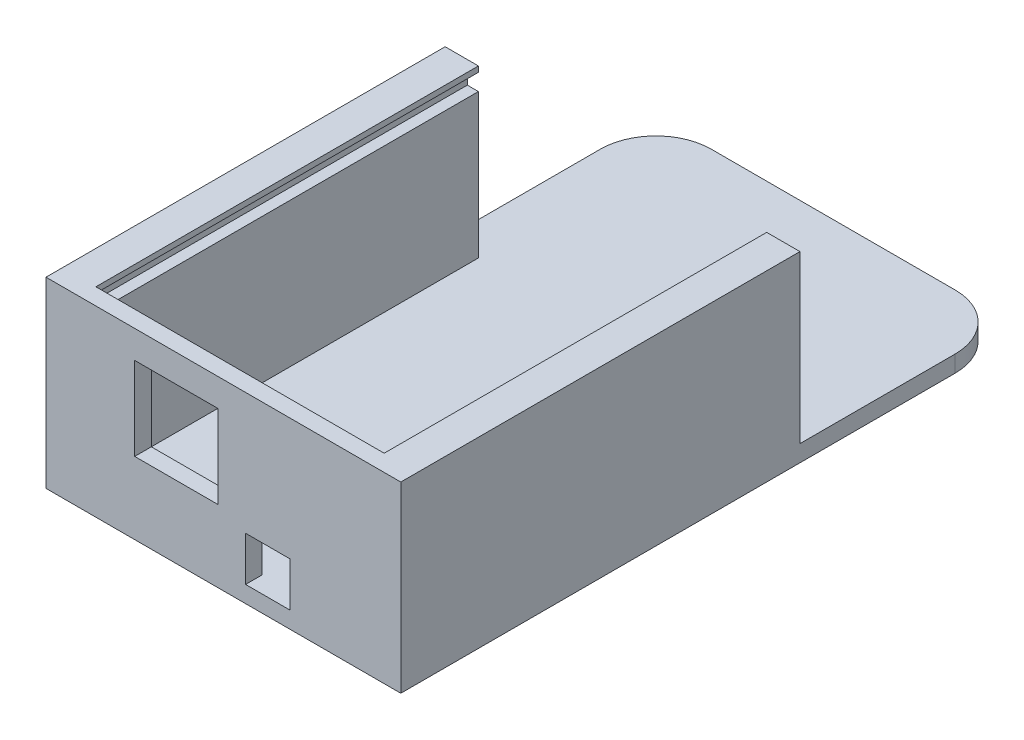
ISO-10303-21;
HEADER;
FILE_DESCRIPTION(('STEP AP214'),'2;1');
FILE_NAME('part.step','',(''),(''),'','','');
FILE_SCHEMA(('AUTOMOTIVE_DESIGN { 1 0 10303 214 1 1 1 1 }'));
ENDSEC;
DATA;
#1=APPLICATION_CONTEXT('core data for automotive mechanical design processes');
#2=APPLICATION_PROTOCOL_DEFINITION('international standard','automotive_design',2000,#1);
#3=PRODUCT_CONTEXT('',#1,'mechanical');
#4=PRODUCT('Part','Part','',(#3));
#5=PRODUCT_RELATED_PRODUCT_CATEGORY('part','',(#4));
#6=PRODUCT_DEFINITION_FORMATION('','',#4);
#7=PRODUCT_DEFINITION_CONTEXT('part definition',#1,'design');
#8=PRODUCT_DEFINITION('design','',#6,#7);
#9=PRODUCT_DEFINITION_SHAPE('','',#8);
#10=(LENGTH_UNIT() NAMED_UNIT(*) SI_UNIT(.MILLI.,.METRE.));
#11=(NAMED_UNIT(*) PLANE_ANGLE_UNIT() SI_UNIT($,.RADIAN.));
#12=(NAMED_UNIT(*) SI_UNIT($,.STERADIAN.) SOLID_ANGLE_UNIT());
#13=UNCERTAINTY_MEASURE_WITH_UNIT(LENGTH_MEASURE(1.E-05),#10,'distance_accuracy_value','');
#14=(GEOMETRIC_REPRESENTATION_CONTEXT(3) GLOBAL_UNCERTAINTY_ASSIGNED_CONTEXT((#13)) GLOBAL_UNIT_ASSIGNED_CONTEXT((#10,
#11,#12)) REPRESENTATION_CONTEXT('',''));
#15=CARTESIAN_POINT('',(0.,0.,0.));
#16=DIRECTION('',(0.,0.,1.));
#17=DIRECTION('',(1.,0.,0.));
#18=AXIS2_PLACEMENT_3D('',#15,#16,#17);
#19=CARTESIAN_POINT('',(-26.,33.,0.));
#20=DIRECTION('',(-1.,0.,0.));
#21=DIRECTION('',(0.,0.,1.));
#22=AXIS2_PLACEMENT_3D('',#19,#20,#21);
#23=PLANE('',#22);
#24=DIRECTION('',(0.,0.,-1.));
#25=VECTOR('',#24,1.);
#26=CARTESIAN_POINT('',(-26.,29.,0.605551275463995));
#27=LINE('',#26,#25);
#28=CARTESIAN_POINT('',(-26.,29.,-2.99999999999999));
#29=VERTEX_POINT('',#28);
#30=CARTESIAN_POINT('',(-26.,29.,-72.));
#31=VERTEX_POINT('',#30);
#32=EDGE_CURVE('E342',#29,#31,#27,.T.);
#33=ORIENTED_EDGE('',*,*,#32,.F.);
#34=DIRECTION('',(0.,-1.,0.));
#35=VECTOR('',#34,1.);
#36=CARTESIAN_POINT('',(-26.,33.,-2.99999999999999));
#37=LINE('',#36,#35);
#38=CARTESIAN_POINT('',(-26.,3.,-2.99999999999999));
#39=VERTEX_POINT('',#38);
#40=EDGE_CURVE('E384',#29,#39,#37,.T.);
#41=ORIENTED_EDGE('',*,*,#40,.T.);
#42=DIRECTION('',(0.,0.,-1.));
#43=VECTOR('',#42,1.);
#44=CARTESIAN_POINT('',(-26.,3.,0.));
#45=LINE('',#44,#43);
#46=CARTESIAN_POINT('',(-26.,3.,-72.));
#47=VERTEX_POINT('',#46);
#48=EDGE_CURVE('E330',#39,#47,#45,.T.);
#49=ORIENTED_EDGE('',*,*,#48,.T.);
#50=DIRECTION('',(0.,-1.,0.));
#51=VECTOR('',#50,1.);
#52=CARTESIAN_POINT('',(-26.,33.,-72.));
#53=LINE('',#52,#51);
#54=EDGE_CURVE('E379',#31,#47,#53,.T.);
#55=ORIENTED_EDGE('',*,*,#54,.F.);
#56=EDGE_LOOP('',(#33,#41,#49,#55));
#57=FACE_BOUND('',#56,.T.);
#58=ADVANCED_FACE('F45',(#57),#23,.F.);
#59=DIRECTION('',(0.,0.,-1.));
#60=VECTOR('',#59,1.);
#61=CARTESIAN_POINT('',(-26.,32.,0.605551275463995));
#62=LINE('',#61,#60);
#63=CARTESIAN_POINT('',(-26.,32.,-2.99999999999999));
#64=VERTEX_POINT('',#63);
#65=CARTESIAN_POINT('',(-26.,32.,-72.));
#66=VERTEX_POINT('',#65);
#67=EDGE_CURVE('E343',#64,#66,#62,.T.);
#68=ORIENTED_EDGE('',*,*,#67,.T.);
#69=CARTESIAN_POINT('',(-26.,33.,-72.));
#70=VERTEX_POINT('',#69);
#71=EDGE_CURVE('E380',#70,#66,#53,.T.);
#72=ORIENTED_EDGE('',*,*,#71,.F.);
#73=DIRECTION('',(0.,0.,-1.));
#74=VECTOR('',#73,1.);
#75=CARTESIAN_POINT('',(-26.,33.,0.));
#76=LINE('',#75,#74);
#77=CARTESIAN_POINT('',(-26.,33.,-2.99999999999999));
#78=VERTEX_POINT('',#77);
#79=EDGE_CURVE('E359',#78,#70,#76,.T.);
#80=ORIENTED_EDGE('',*,*,#79,.F.);
#81=EDGE_CURVE('E385',#78,#64,#37,.T.);
#82=ORIENTED_EDGE('',*,*,#81,.T.);
#83=EDGE_LOOP('',(#68,#72,#80,#82));
#84=FACE_BOUND('',#83,.T.);
#85=ADVANCED_FACE('F590',(#84),#23,.F.);
#86=CARTESIAN_POINT('',(0.,33.,-72.));
#87=DIRECTION('',(0.,0.,1.));
#88=DIRECTION('',(1.,0.,0.));
#89=AXIS2_PLACEMENT_3D('',#86,#87,#88);
#90=PLANE('',#89);
#91=DIRECTION('',(1.,0.,0.));
#92=VECTOR('',#91,1.);
#93=CARTESIAN_POINT('',(-28.,29.,-72.));
#94=LINE('',#93,#92);
#95=CARTESIAN_POINT('',(-28.,29.,-72.));
#96=VERTEX_POINT('',#95);
#97=EDGE_CURVE('E278',#96,#31,#94,.T.);
#98=ORIENTED_EDGE('',*,*,#97,.T.);
#99=ORIENTED_EDGE('',*,*,#54,.T.);
#100=DIRECTION('',(-1.,0.,0.));
#101=VECTOR('',#100,1.);
#102=CARTESIAN_POINT('',(0.,3.,-72.));
#103=LINE('',#102,#101);
#104=CARTESIAN_POINT('',(-32.,3.,-72.));
#105=VERTEX_POINT('',#104);
#106=EDGE_CURVE('E363',#47,#105,#103,.T.);
#107=ORIENTED_EDGE('',*,*,#106,.T.);
#108=DIRECTION('',(0.,-1.,0.));
#109=VECTOR('',#108,1.);
#110=CARTESIAN_POINT('',(-32.,33.,-72.));
#111=LINE('',#110,#109);
#112=CARTESIAN_POINT('',(-32.,33.,-72.));
#113=VERTEX_POINT('',#112);
#114=EDGE_CURVE('E370',#113,#105,#111,.T.);
#115=ORIENTED_EDGE('',*,*,#114,.F.);
#116=DIRECTION('',(-1.,0.,0.));
#117=VECTOR('',#116,1.);
#118=CARTESIAN_POINT('',(0.,33.,-72.));
#119=LINE('',#118,#117);
#120=EDGE_CURVE('E362',#70,#113,#119,.T.);
#121=ORIENTED_EDGE('',*,*,#120,.F.);
#122=ORIENTED_EDGE('',*,*,#71,.T.);
#123=DIRECTION('',(-0.707106781186544,-0.707106781186551,0.));
#124=VECTOR('',#123,1.);
#125=CARTESIAN_POINT('',(-26.,32.,-72.));
#126=LINE('',#125,#124);
#127=CARTESIAN_POINT('',(-28.,30.,-72.));
#128=VERTEX_POINT('',#127);
#129=EDGE_CURVE('E338',#66,#128,#126,.T.);
#130=ORIENTED_EDGE('',*,*,#129,.T.);
#131=DIRECTION('',(0.,-1.,0.));
#132=VECTOR('',#131,1.);
#133=CARTESIAN_POINT('',(-28.,30.,-72.));
#134=LINE('',#133,#132);
#135=EDGE_CURVE('E334',#128,#96,#134,.T.);
#136=ORIENTED_EDGE('',*,*,#135,.T.);
#137=EDGE_LOOP('',(#98,#99,#107,#115,#121,#122,#130,#136));
#138=FACE_BOUND('',#137,.T.);
#139=ADVANCED_FACE('F552',(#138),#90,.F.);
#140=CARTESIAN_POINT('',(0.,3.,0.));
#141=DIRECTION('',(0.,-1.,0.));
#142=DIRECTION('',(0.,0.,-1.));
#143=AXIS2_PLACEMENT_3D('',#140,#141,#142);
#144=PLANE('',#143);
#145=DIRECTION('',(-1.,0.,0.));
#146=VECTOR('',#145,1.);
#147=CARTESIAN_POINT('',(0.,3.,-110.));
#148=LINE('',#147,#146);
#149=CARTESIAN_POINT('',(22.,3.,-110.));
#150=VERTEX_POINT('',#149);
#151=CARTESIAN_POINT('',(-22.,3.,-110.));
#152=VERTEX_POINT('',#151);
#153=EDGE_CURVE('E484',#150,#152,#148,.T.);
#154=ORIENTED_EDGE('',*,*,#153,.T.);
#155=CARTESIAN_POINT('',(-22.,3.,-100.));
#156=DIRECTION('',(0.,-1.,0.));
#157=DIRECTION('',(0.,0.,-1.));
#158=AXIS2_PLACEMENT_3D('',#155,#156,#157);
#159=CIRCLE('',#158,10.);
#160=CARTESIAN_POINT('',(-32.,3.,-100.));
#161=VERTEX_POINT('',#160);
#162=EDGE_CURVE('E11',#152,#161,#159,.F.);
#163=ORIENTED_EDGE('',*,*,#162,.T.);
#164=DIRECTION('',(0.,0.,-1.));
#165=VECTOR('',#164,1.);
#166=CARTESIAN_POINT('',(-32.,3.,0.));
#167=LINE('',#166,#165);
#168=EDGE_CURVE('E390',#105,#161,#167,.T.);
#169=ORIENTED_EDGE('',*,*,#168,.F.);
#170=ORIENTED_EDGE('',*,*,#106,.F.);
#171=ORIENTED_EDGE('',*,*,#48,.F.);
#172=DIRECTION('',(1.,0.,0.));
#173=VECTOR('',#172,1.);
#174=CARTESIAN_POINT('',(0.,3.,-3.));
#175=LINE('',#174,#173);
#176=CARTESIAN_POINT('',(4.,3.,-3.));
#177=VERTEX_POINT('',#176);
#178=EDGE_CURVE('E456',#39,#177,#175,.T.);
#179=ORIENTED_EDGE('',*,*,#178,.T.);
#180=DIRECTION('',(0.,0.,-1.));
#181=VECTOR('',#180,1.);
#182=CARTESIAN_POINT('',(4.,3.,0.));
#183=LINE('',#182,#181);
#184=CARTESIAN_POINT('',(4.,3.,0.));
#185=VERTEX_POINT('',#184);
#186=EDGE_CURVE('E289',#185,#177,#183,.T.);
#187=ORIENTED_EDGE('',*,*,#186,.F.);
#188=DIRECTION('',(-1.,0.,0.));
#189=VECTOR('',#188,1.);
#190=CARTESIAN_POINT('',(12.,3.,0.));
#191=LINE('',#190,#189);
#192=CARTESIAN_POINT('',(12.,3.,0.));
#193=VERTEX_POINT('',#192);
#194=EDGE_CURVE('E314',#193,#185,#191,.T.);
#195=ORIENTED_EDGE('',*,*,#194,.F.);
#196=DIRECTION('',(0.,0.,-1.));
#197=VECTOR('',#196,1.);
#198=CARTESIAN_POINT('',(12.,3.,0.));
#199=LINE('',#198,#197);
#200=CARTESIAN_POINT('',(12.,3.,-3.));
#201=VERTEX_POINT('',#200);
#202=EDGE_CURVE('E284',#193,#201,#199,.T.);
#203=ORIENTED_EDGE('',*,*,#202,.T.);
#204=CARTESIAN_POINT('',(26.,3.,-3.));
#205=VERTEX_POINT('',#204);
#206=EDGE_CURVE('E434',#201,#205,#175,.T.);
#207=ORIENTED_EDGE('',*,*,#206,.T.);
#208=DIRECTION('',(0.,0.,-1.));
#209=VECTOR('',#208,1.);
#210=CARTESIAN_POINT('',(26.,3.,0.));
#211=LINE('',#210,#209);
#212=CARTESIAN_POINT('',(26.,3.,-72.));
#213=VERTEX_POINT('',#212);
#214=EDGE_CURVE('E440',#205,#213,#211,.T.);
#215=ORIENTED_EDGE('',*,*,#214,.T.);
#216=DIRECTION('',(1.,0.,0.));
#217=VECTOR('',#216,1.);
#218=CARTESIAN_POINT('',(0.,3.,-72.));
#219=LINE('',#218,#217);
#220=CARTESIAN_POINT('',(32.,3.,-72.));
#221=VERTEX_POINT('',#220);
#222=EDGE_CURVE('E460',#213,#221,#219,.T.);
#223=ORIENTED_EDGE('',*,*,#222,.T.);
#224=DIRECTION('',(0.,0.,-1.));
#225=VECTOR('',#224,1.);
#226=CARTESIAN_POINT('',(32.,3.,0.));
#227=LINE('',#226,#225);
#228=CARTESIAN_POINT('',(32.,3.,-100.));
#229=VERTEX_POINT('',#228);
#230=EDGE_CURVE('E480',#221,#229,#227,.T.);
#231=ORIENTED_EDGE('',*,*,#230,.T.);
#232=CARTESIAN_POINT('',(22.,3.,-100.));
#233=DIRECTION('',(0.,-1.,0.));
#234=DIRECTION('',(0.,0.,-1.));
#235=AXIS2_PLACEMENT_3D('',#232,#233,#234);
#236=CIRCLE('',#235,10.);
#237=EDGE_CURVE('E512',#229,#150,#236,.F.);
#238=ORIENTED_EDGE('',*,*,#237,.T.);
#239=EDGE_LOOP('',(#154,#163,#169,#170,#171,#179,#187,#195,#203,#207,#215,#223,#231,#238));
#240=FACE_BOUND('',#239,.T.);
#241=ADVANCED_FACE('F531',(#240),#144,.F.);
#242=CARTESIAN_POINT('',(26.,33.,0.));
#243=DIRECTION('',(-1.,0.,0.));
#244=DIRECTION('',(0.,0.,1.));
#245=AXIS2_PLACEMENT_3D('',#242,#243,#244);
#246=PLANE('',#245);
#247=DIRECTION('',(0.,0.,-1.));
#248=VECTOR('',#247,1.);
#249=CARTESIAN_POINT('',(26.,29.,0.605551275463995));
#250=LINE('',#249,#248);
#251=CARTESIAN_POINT('',(26.,29.,-3.));
#252=VERTEX_POINT('',#251);
#253=CARTESIAN_POINT('',(26.,29.,-72.));
#254=VERTEX_POINT('',#253);
#255=EDGE_CURVE('E406',#252,#254,#250,.T.);
#256=ORIENTED_EDGE('',*,*,#255,.T.);
#257=DIRECTION('',(0.,-1.,0.));
#258=VECTOR('',#257,1.);
#259=CARTESIAN_POINT('',(26.,33.,-72.));
#260=LINE('',#259,#258);
#261=EDGE_CURVE('E471',#254,#213,#260,.T.);
#262=ORIENTED_EDGE('',*,*,#261,.T.);
#263=ORIENTED_EDGE('',*,*,#214,.F.);
#264=DIRECTION('',(0.,-1.,0.));
#265=VECTOR('',#264,1.);
#266=CARTESIAN_POINT('',(26.,33.,-3.));
#267=LINE('',#266,#265);
#268=EDGE_CURVE('E455',#252,#205,#267,.T.);
#269=ORIENTED_EDGE('',*,*,#268,.F.);
#270=EDGE_LOOP('',(#256,#262,#263,#269));
#271=FACE_BOUND('',#270,.T.);
#272=ADVANCED_FACE('F612',(#271),#246,.T.);
#273=CARTESIAN_POINT('',(0.,3.,0.));
#274=DIRECTION('',(0.,0.,-1.));
#275=DIRECTION('',(-1.,0.,0.));
#276=AXIS2_PLACEMENT_3D('',#273,#274,#275);
#277=PLANE('',#276);
#278=DIRECTION('',(1.,0.,0.));
#279=VECTOR('',#278,1.);
#280=CARTESIAN_POINT('',(-0.999999999999997,28.,0.));
#281=LINE('',#280,#279);
#282=CARTESIAN_POINT('',(-16.,28.,0.));
#283=VERTEX_POINT('',#282);
#284=CARTESIAN_POINT('',(-0.999999999999997,28.,0.));
#285=VERTEX_POINT('',#284);
#286=EDGE_CURVE('E243',#283,#285,#281,.T.);
#287=ORIENTED_EDGE('',*,*,#286,.T.);
#288=DIRECTION('',(0.,-1.,0.));
#289=VECTOR('',#288,1.);
#290=CARTESIAN_POINT('',(-0.999999999999997,28.,0.));
#291=LINE('',#290,#289);
#292=CARTESIAN_POINT('',(-0.999999999999999,13.,0.));
#293=VERTEX_POINT('',#292);
#294=EDGE_CURVE('E234',#285,#293,#291,.T.);
#295=ORIENTED_EDGE('',*,*,#294,.T.);
#296=DIRECTION('',(-1.,0.,0.));
#297=VECTOR('',#296,1.);
#298=CARTESIAN_POINT('',(-0.999999999999999,13.,0.));
#299=LINE('',#298,#297);
#300=CARTESIAN_POINT('',(-16.,13.,0.));
#301=VERTEX_POINT('',#300);
#302=EDGE_CURVE('E246',#293,#301,#299,.T.);
#303=ORIENTED_EDGE('',*,*,#302,.T.);
#304=DIRECTION('',(0.,1.,0.));
#305=VECTOR('',#304,1.);
#306=CARTESIAN_POINT('',(-16.,28.,0.));
#307=LINE('',#306,#305);
#308=EDGE_CURVE('E61',#301,#283,#307,.T.);
#309=ORIENTED_EDGE('',*,*,#308,.T.);
#310=EDGE_LOOP('',(#287,#295,#303,#309));
#311=FACE_BOUND('',#310,.T.);
#312=DIRECTION('',(1.,0.,0.));
#313=VECTOR('',#312,1.);
#314=CARTESIAN_POINT('',(12.,11.,0.));
#315=LINE('',#314,#313);
#316=CARTESIAN_POINT('',(4.,11.,0.));
#317=VERTEX_POINT('',#316);
#318=CARTESIAN_POINT('',(12.,11.,0.));
#319=VERTEX_POINT('',#318);
#320=EDGE_CURVE('E288',#317,#319,#315,.T.);
#321=ORIENTED_EDGE('',*,*,#320,.T.);
#322=DIRECTION('',(0.,-1.,0.));
#323=VECTOR('',#322,1.);
#324=CARTESIAN_POINT('',(12.,11.,0.));
#325=LINE('',#324,#323);
#326=EDGE_CURVE('E303',#319,#193,#325,.T.);
#327=ORIENTED_EDGE('',*,*,#326,.T.);
#328=ORIENTED_EDGE('',*,*,#194,.T.);
#329=DIRECTION('',(0.,1.,0.));
#330=VECTOR('',#329,1.);
#331=CARTESIAN_POINT('',(4.,11.,0.));
#332=LINE('',#331,#330);
#333=EDGE_CURVE('E69',#185,#317,#332,.T.);
#334=ORIENTED_EDGE('',*,*,#333,.T.);
#335=EDGE_LOOP('',(#321,#327,#328,#334));
#336=FACE_BOUND('',#335,.T.);
#337=DIRECTION('',(1.,0.,0.));
#338=VECTOR('',#337,1.);
#339=CARTESIAN_POINT('',(0.,0.,0.));
#340=LINE('',#339,#338);
#341=CARTESIAN_POINT('',(-32.,0.,0.));
#342=VERTEX_POINT('',#341);
#343=CARTESIAN_POINT('',(32.,0.,0.));
#344=VERTEX_POINT('',#343);
#345=EDGE_CURVE('E479',#342,#344,#340,.T.);
#346=ORIENTED_EDGE('',*,*,#345,.T.);
#347=DIRECTION('',(0.,-1.,0.));
#348=VECTOR('',#347,1.);
#349=CARTESIAN_POINT('',(32.,3.,0.));
#350=LINE('',#349,#348);
#351=CARTESIAN_POINT('',(32.,33.,0.));
#352=VERTEX_POINT('',#351);
#353=EDGE_CURVE('E489',#352,#344,#350,.T.);
#354=ORIENTED_EDGE('',*,*,#353,.F.);
#355=DIRECTION('',(1.,0.,0.));
#356=VECTOR('',#355,1.);
#357=CARTESIAN_POINT('',(0.,33.,0.));
#358=LINE('',#357,#356);
#359=CARTESIAN_POINT('',(-32.,33.,0.));
#360=VERTEX_POINT('',#359);
#361=EDGE_CURVE('E439',#360,#352,#358,.T.);
#362=ORIENTED_EDGE('',*,*,#361,.F.);
#363=DIRECTION('',(0.,-1.,0.));
#364=VECTOR('',#363,1.);
#365=CARTESIAN_POINT('',(-32.,3.,0.));
#366=LINE('',#365,#364);
#367=EDGE_CURVE('E394',#360,#342,#366,.T.);
#368=ORIENTED_EDGE('',*,*,#367,.T.);
#369=EDGE_LOOP('',(#346,#354,#362,#368));
#370=FACE_BOUND('',#369,.T.);
#371=ADVANCED_FACE('F251',(#311,#336,#370),#277,.F.);
#372=CARTESIAN_POINT('',(32.,3.,0.));
#373=DIRECTION('',(-1.,0.,0.));
#374=DIRECTION('',(0.,0.,1.));
#375=AXIS2_PLACEMENT_3D('',#372,#373,#374);
#376=PLANE('',#375);
#377=DIRECTION('',(0.,0.,-1.));
#378=VECTOR('',#377,1.);
#379=CARTESIAN_POINT('',(32.,0.,0.));
#380=LINE('',#379,#378);
#381=CARTESIAN_POINT('',(32.,0.,-100.));
#382=VERTEX_POINT('',#381);
#383=EDGE_CURVE('E492',#344,#382,#380,.T.);
#384=ORIENTED_EDGE('',*,*,#383,.T.);
#385=DIRECTION('',(0.,-1.,0.));
#386=VECTOR('',#385,1.);
#387=CARTESIAN_POINT('',(32.,3.,-100.));
#388=LINE('',#387,#386);
#389=EDGE_CURVE('E509',#382,#229,#388,.F.);
#390=ORIENTED_EDGE('',*,*,#389,.T.);
#391=ORIENTED_EDGE('',*,*,#230,.F.);
#392=DIRECTION('',(0.,-1.,0.));
#393=VECTOR('',#392,1.);
#394=CARTESIAN_POINT('',(32.,33.,-72.));
#395=LINE('',#394,#393);
#396=CARTESIAN_POINT('',(32.,33.,-72.));
#397=VERTEX_POINT('',#396);
#398=EDGE_CURVE('E476',#397,#221,#395,.T.);
#399=ORIENTED_EDGE('',*,*,#398,.F.);
#400=DIRECTION('',(0.,0.,-1.));
#401=VECTOR('',#400,1.);
#402=CARTESIAN_POINT('',(32.,33.,0.));
#403=LINE('',#402,#401);
#404=EDGE_CURVE('E444',#352,#397,#403,.T.);
#405=ORIENTED_EDGE('',*,*,#404,.F.);
#406=ORIENTED_EDGE('',*,*,#353,.T.);
#407=EDGE_LOOP('',(#384,#390,#391,#399,#405,#406));
#408=FACE_BOUND('',#407,.T.);
#409=ADVANCED_FACE('F619',(#408),#376,.F.);
#410=CARTESIAN_POINT('',(0.,3.,-110.));
#411=DIRECTION('',(0.,0.,1.));
#412=DIRECTION('',(1.,0.,0.));
#413=AXIS2_PLACEMENT_3D('',#410,#411,#412);
#414=PLANE('',#413);
#415=DIRECTION('',(-1.,0.,0.));
#416=VECTOR('',#415,1.);
#417=CARTESIAN_POINT('',(0.,0.,-110.));
#418=LINE('',#417,#416);
#419=CARTESIAN_POINT('',(22.,0.,-110.));
#420=VERTEX_POINT('',#419);
#421=CARTESIAN_POINT('',(-22.,0.,-110.));
#422=VERTEX_POINT('',#421);
#423=EDGE_CURVE('E485',#420,#422,#418,.T.);
#424=ORIENTED_EDGE('',*,*,#423,.T.);
#425=DIRECTION('',(0.,-1.,0.));
#426=VECTOR('',#425,1.);
#427=CARTESIAN_POINT('',(-22.,3.,-110.));
#428=LINE('',#427,#426);
#429=EDGE_CURVE('E54',#422,#152,#428,.F.);
#430=ORIENTED_EDGE('',*,*,#429,.T.);
#431=ORIENTED_EDGE('',*,*,#153,.F.);
#432=DIRECTION('',(0.,-1.,0.));
#433=VECTOR('',#432,1.);
#434=CARTESIAN_POINT('',(22.,3.,-110.));
#435=LINE('',#434,#433);
#436=EDGE_CURVE('E502',#150,#420,#435,.T.);
#437=ORIENTED_EDGE('',*,*,#436,.T.);
#438=EDGE_LOOP('',(#424,#430,#431,#437));
#439=FACE_BOUND('',#438,.T.);
#440=ADVANCED_FACE('F525',(#439),#414,.F.);
#441=CARTESIAN_POINT('',(0.,0.,0.));
#442=DIRECTION('',(0.,-1.,0.));
#443=DIRECTION('',(0.,0.,-1.));
#444=AXIS2_PLACEMENT_3D('',#441,#442,#443);
#445=PLANE('',#444);
#446=DIRECTION('',(0.,0.,-1.));
#447=VECTOR('',#446,1.);
#448=CARTESIAN_POINT('',(-32.,0.,0.));
#449=LINE('',#448,#447);
#450=CARTESIAN_POINT('',(-32.,0.,-100.));
#451=VERTEX_POINT('',#450);
#452=EDGE_CURVE('E389',#342,#451,#449,.T.);
#453=ORIENTED_EDGE('',*,*,#452,.T.);
#454=CARTESIAN_POINT('',(-22.,0.,-100.));
#455=DIRECTION('',(0.,-1.,0.));
#456=DIRECTION('',(0.,0.,-1.));
#457=AXIS2_PLACEMENT_3D('',#454,#455,#456);
#458=CIRCLE('',#457,10.);
#459=EDGE_CURVE('E519',#451,#422,#458,.T.);
#460=ORIENTED_EDGE('',*,*,#459,.T.);
#461=ORIENTED_EDGE('',*,*,#423,.F.);
#462=CARTESIAN_POINT('',(22.,0.,-100.));
#463=DIRECTION('',(0.,-1.,0.));
#464=DIRECTION('',(0.,0.,-1.));
#465=AXIS2_PLACEMENT_3D('',#462,#463,#464);
#466=CIRCLE('',#465,10.);
#467=EDGE_CURVE('E506',#420,#382,#466,.T.);
#468=ORIENTED_EDGE('',*,*,#467,.T.);
#469=ORIENTED_EDGE('',*,*,#383,.F.);
#470=ORIENTED_EDGE('',*,*,#345,.F.);
#471=EDGE_LOOP('',(#453,#460,#461,#468,#469,#470));
#472=FACE_BOUND('',#471,.T.);
#473=ADVANCED_FACE('F540',(#472),#445,.T.);
#474=CARTESIAN_POINT('',(0.,33.,-3.));
#475=DIRECTION('',(0.,0.,-1.));
#476=DIRECTION('',(-1.,0.,0.));
#477=AXIS2_PLACEMENT_3D('',#474,#475,#476);
#478=PLANE('',#477);
#479=DIRECTION('',(0.,-1.,0.));
#480=VECTOR('',#479,1.);
#481=CARTESIAN_POINT('',(-0.999999999999997,28.,-3.));
#482=LINE('',#481,#480);
#483=CARTESIAN_POINT('',(-0.999999999999997,28.,-3.));
#484=VERTEX_POINT('',#483);
#485=CARTESIAN_POINT('',(-0.999999999999999,13.,-3.));
#486=VERTEX_POINT('',#485);
#487=EDGE_CURVE('E237',#484,#486,#482,.T.);
#488=ORIENTED_EDGE('',*,*,#487,.F.);
#489=DIRECTION('',(1.,0.,0.));
#490=VECTOR('',#489,1.);
#491=CARTESIAN_POINT('',(-0.999999999999997,28.,-3.));
#492=LINE('',#491,#490);
#493=CARTESIAN_POINT('',(-16.,28.,-3.));
#494=VERTEX_POINT('',#493);
#495=EDGE_CURVE('E255',#494,#484,#492,.T.);
#496=ORIENTED_EDGE('',*,*,#495,.F.);
#497=DIRECTION('',(0.,1.,0.));
#498=VECTOR('',#497,1.);
#499=CARTESIAN_POINT('',(-16.,28.,-3.));
#500=LINE('',#499,#498);
#501=CARTESIAN_POINT('',(-16.,13.,-3.));
#502=VERTEX_POINT('',#501);
#503=EDGE_CURVE('E259',#502,#494,#500,.T.);
#504=ORIENTED_EDGE('',*,*,#503,.F.);
#505=DIRECTION('',(-1.,0.,0.));
#506=VECTOR('',#505,1.);
#507=CARTESIAN_POINT('',(-0.999999999999999,13.,-3.));
#508=LINE('',#507,#506);
#509=EDGE_CURVE('E268',#486,#502,#508,.T.);
#510=ORIENTED_EDGE('',*,*,#509,.F.);
#511=EDGE_LOOP('',(#488,#496,#504,#510));
#512=FACE_BOUND('',#511,.T.);
#513=DIRECTION('',(0.,-1.,0.));
#514=VECTOR('',#513,1.);
#515=CARTESIAN_POINT('',(12.,11.,-3.));
#516=LINE('',#515,#514);
#517=CARTESIAN_POINT('',(12.,11.,-3.));
#518=VERTEX_POINT('',#517);
#519=EDGE_CURVE('E269',#518,#201,#516,.T.);
#520=ORIENTED_EDGE('',*,*,#519,.F.);
#521=DIRECTION('',(1.,0.,0.));
#522=VECTOR('',#521,1.);
#523=CARTESIAN_POINT('',(12.,11.,-3.));
#524=LINE('',#523,#522);
#525=CARTESIAN_POINT('',(4.,11.,-3.));
#526=VERTEX_POINT('',#525);
#527=EDGE_CURVE('E298',#526,#518,#524,.T.);
#528=ORIENTED_EDGE('',*,*,#527,.F.);
#529=DIRECTION('',(0.,1.,0.));
#530=VECTOR('',#529,1.);
#531=CARTESIAN_POINT('',(4.,11.,-3.));
#532=LINE('',#531,#530);
#533=EDGE_CURVE('E302',#177,#526,#532,.T.);
#534=ORIENTED_EDGE('',*,*,#533,.F.);
#535=ORIENTED_EDGE('',*,*,#178,.F.);
#536=ORIENTED_EDGE('',*,*,#40,.F.);
#537=DIRECTION('',(-1.,0.,0.));
#538=VECTOR('',#537,1.);
#539=CARTESIAN_POINT('',(-28.,29.,-2.99999999999999));
#540=LINE('',#539,#538);
#541=CARTESIAN_POINT('',(-28.,29.,-2.99999999999999));
#542=VERTEX_POINT('',#541);
#543=EDGE_CURVE('E326',#29,#542,#540,.T.);
#544=ORIENTED_EDGE('',*,*,#543,.T.);
#545=DIRECTION('',(0.,1.,0.));
#546=VECTOR('',#545,1.);
#547=CARTESIAN_POINT('',(-28.,30.,-2.99999999999999));
#548=LINE('',#547,#546);
#549=CARTESIAN_POINT('',(-28.,30.,-2.99999999999999));
#550=VERTEX_POINT('',#549);
#551=EDGE_CURVE('E321',#542,#550,#548,.T.);
#552=ORIENTED_EDGE('',*,*,#551,.T.);
#553=DIRECTION('',(0.707106781186544,0.707106781186551,0.));
#554=VECTOR('',#553,1.);
#555=CARTESIAN_POINT('',(-26.,32.,-2.99999999999999));
#556=LINE('',#555,#554);
#557=EDGE_CURVE('E325',#550,#64,#556,.T.);
#558=ORIENTED_EDGE('',*,*,#557,.T.);
#559=ORIENTED_EDGE('',*,*,#81,.F.);
#560=DIRECTION('',(1.,0.,0.));
#561=VECTOR('',#560,1.);
#562=CARTESIAN_POINT('',(0.,33.,-3.));
#563=LINE('',#562,#561);
#564=CARTESIAN_POINT('',(26.,33.,-3.));
#565=VERTEX_POINT('',#564);
#566=EDGE_CURVE('E435',#78,#565,#563,.T.);
#567=ORIENTED_EDGE('',*,*,#566,.T.);
#568=CARTESIAN_POINT('',(26.,32.,-3.));
#569=VERTEX_POINT('',#568);
#570=EDGE_CURVE('E467',#565,#569,#267,.T.);
#571=ORIENTED_EDGE('',*,*,#570,.T.);
#572=DIRECTION('',(-0.707106781186544,0.707106781186551,0.));
#573=VECTOR('',#572,1.);
#574=CARTESIAN_POINT('',(26.,32.,-3.));
#575=LINE('',#574,#573);
#576=CARTESIAN_POINT('',(28.,30.,-3.));
#577=VERTEX_POINT('',#576);
#578=EDGE_CURVE('E409',#577,#569,#575,.T.);
#579=ORIENTED_EDGE('',*,*,#578,.F.);
#580=DIRECTION('',(0.,1.,0.));
#581=VECTOR('',#580,1.);
#582=CARTESIAN_POINT('',(28.,30.,-3.));
#583=LINE('',#582,#581);
#584=CARTESIAN_POINT('',(28.,29.,-3.));
#585=VERTEX_POINT('',#584);
#586=EDGE_CURVE('E402',#585,#577,#583,.T.);
#587=ORIENTED_EDGE('',*,*,#586,.F.);
#588=DIRECTION('',(1.,0.,0.));
#589=VECTOR('',#588,1.);
#590=CARTESIAN_POINT('',(28.,29.,-3.));
#591=LINE('',#590,#589);
#592=EDGE_CURVE('E405',#252,#585,#591,.T.);
#593=ORIENTED_EDGE('',*,*,#592,.F.);
#594=ORIENTED_EDGE('',*,*,#268,.T.);
#595=ORIENTED_EDGE('',*,*,#206,.F.);
#596=EDGE_LOOP('',(#520,#528,#534,#535,#536,#544,#552,#558,#559,#567,#571,#579,#587,#593,#594,#595));
#597=FACE_BOUND('',#596,.T.);
#598=ADVANCED_FACE('F564',(#512,#597),#478,.T.);
#599=CARTESIAN_POINT('',(0.,33.,-72.));
#600=DIRECTION('',(0.,0.,-1.));
#601=DIRECTION('',(-1.,0.,0.));
#602=AXIS2_PLACEMENT_3D('',#599,#600,#601);
#603=PLANE('',#602);
#604=DIRECTION('',(-1.,0.,0.));
#605=VECTOR('',#604,1.);
#606=CARTESIAN_POINT('',(28.,29.,-72.));
#607=LINE('',#606,#605);
#608=CARTESIAN_POINT('',(28.,29.,-72.));
#609=VERTEX_POINT('',#608);
#610=EDGE_CURVE('E417',#609,#254,#607,.T.);
#611=ORIENTED_EDGE('',*,*,#610,.F.);
#612=DIRECTION('',(0.,-1.,0.));
#613=VECTOR('',#612,1.);
#614=CARTESIAN_POINT('',(28.,30.,-72.));
#615=LINE('',#614,#613);
#616=CARTESIAN_POINT('',(28.,30.,-72.));
#617=VERTEX_POINT('',#616);
#618=EDGE_CURVE('E413',#617,#609,#615,.T.);
#619=ORIENTED_EDGE('',*,*,#618,.F.);
#620=DIRECTION('',(0.707106781186544,-0.707106781186551,0.));
#621=VECTOR('',#620,1.);
#622=CARTESIAN_POINT('',(26.,32.,-72.));
#623=LINE('',#622,#621);
#624=CARTESIAN_POINT('',(26.,32.,-72.));
#625=VERTEX_POINT('',#624);
#626=EDGE_CURVE('E401',#625,#617,#623,.T.);
#627=ORIENTED_EDGE('',*,*,#626,.F.);
#628=CARTESIAN_POINT('',(26.,33.,-72.));
#629=VERTEX_POINT('',#628);
#630=EDGE_CURVE('E472',#629,#625,#260,.T.);
#631=ORIENTED_EDGE('',*,*,#630,.F.);
#632=DIRECTION('',(1.,0.,0.));
#633=VECTOR('',#632,1.);
#634=CARTESIAN_POINT('',(0.,33.,-72.));
#635=LINE('',#634,#633);
#636=EDGE_CURVE('E447',#629,#397,#635,.T.);
#637=ORIENTED_EDGE('',*,*,#636,.T.);
#638=ORIENTED_EDGE('',*,*,#398,.T.);
#639=ORIENTED_EDGE('',*,*,#222,.F.);
#640=ORIENTED_EDGE('',*,*,#261,.F.);
#641=EDGE_LOOP('',(#611,#619,#627,#631,#637,#638,#639,#640));
#642=FACE_BOUND('',#641,.T.);
#643=ADVANCED_FACE('F604',(#642),#603,.T.);
#644=DIRECTION('',(0.,0.,-1.));
#645=VECTOR('',#644,1.);
#646=CARTESIAN_POINT('',(26.,32.,0.605551275463995));
#647=LINE('',#646,#645);
#648=EDGE_CURVE('E420',#569,#625,#647,.T.);
#649=ORIENTED_EDGE('',*,*,#648,.F.);
#650=ORIENTED_EDGE('',*,*,#570,.F.);
#651=DIRECTION('',(0.,0.,-1.));
#652=VECTOR('',#651,1.);
#653=CARTESIAN_POINT('',(26.,33.,0.));
#654=LINE('',#653,#652);
#655=EDGE_CURVE('E451',#565,#629,#654,.T.);
#656=ORIENTED_EDGE('',*,*,#655,.T.);
#657=ORIENTED_EDGE('',*,*,#630,.T.);
#658=EDGE_LOOP('',(#649,#650,#656,#657));
#659=FACE_BOUND('',#658,.T.);
#660=ADVANCED_FACE('F596',(#659),#246,.T.);
#661=CARTESIAN_POINT('',(0.,33.,0.));
#662=DIRECTION('',(0.,1.,0.));
#663=DIRECTION('',(0.,0.,1.));
#664=AXIS2_PLACEMENT_3D('',#661,#662,#663);
#665=PLANE('',#664);
#666=ORIENTED_EDGE('',*,*,#566,.F.);
#667=ORIENTED_EDGE('',*,*,#79,.T.);
#668=ORIENTED_EDGE('',*,*,#120,.T.);
#669=DIRECTION('',(0.,0.,-1.));
#670=VECTOR('',#669,1.);
#671=CARTESIAN_POINT('',(-32.,33.,0.));
#672=LINE('',#671,#670);
#673=EDGE_CURVE('E366',#360,#113,#672,.T.);
#674=ORIENTED_EDGE('',*,*,#673,.F.);
#675=ORIENTED_EDGE('',*,*,#361,.T.);
#676=ORIENTED_EDGE('',*,*,#404,.T.);
#677=ORIENTED_EDGE('',*,*,#636,.F.);
#678=ORIENTED_EDGE('',*,*,#655,.F.);
#679=EDGE_LOOP('',(#666,#667,#668,#674,#675,#676,#677,#678));
#680=FACE_BOUND('',#679,.T.);
#681=ADVANCED_FACE('F545',(#680),#665,.T.);
#682=CARTESIAN_POINT('',(28.,29.,0.605551275463995));
#683=DIRECTION('',(0.,-1.,0.));
#684=DIRECTION('',(0.,0.,-1.));
#685=AXIS2_PLACEMENT_3D('',#682,#683,#684);
#686=PLANE('',#685);
#687=ORIENTED_EDGE('',*,*,#592,.T.);
#688=DIRECTION('',(0.,0.,-1.));
#689=VECTOR('',#688,1.);
#690=CARTESIAN_POINT('',(28.,29.,0.605551275463995));
#691=LINE('',#690,#689);
#692=EDGE_CURVE('E424',#585,#609,#691,.T.);
#693=ORIENTED_EDGE('',*,*,#692,.T.);
#694=ORIENTED_EDGE('',*,*,#610,.T.);
#695=ORIENTED_EDGE('',*,*,#255,.F.);
#696=EDGE_LOOP('',(#687,#693,#694,#695));
#697=FACE_BOUND('',#696,.T.);
#698=ADVANCED_FACE('F639',(#697),#686,.F.);
#699=CARTESIAN_POINT('',(28.,30.,0.605551275463995));
#700=DIRECTION('',(1.,0.,0.));
#701=DIRECTION('',(0.,0.,-1.));
#702=AXIS2_PLACEMENT_3D('',#699,#700,#701);
#703=PLANE('',#702);
#704=ORIENTED_EDGE('',*,*,#586,.T.);
#705=DIRECTION('',(0.,0.,-1.));
#706=VECTOR('',#705,1.);
#707=CARTESIAN_POINT('',(28.,30.,0.605551275463995));
#708=LINE('',#707,#706);
#709=EDGE_CURVE('E427',#577,#617,#708,.T.);
#710=ORIENTED_EDGE('',*,*,#709,.T.);
#711=ORIENTED_EDGE('',*,*,#618,.T.);
#712=ORIENTED_EDGE('',*,*,#692,.F.);
#713=EDGE_LOOP('',(#704,#710,#711,#712));
#714=FACE_BOUND('',#713,.T.);
#715=ADVANCED_FACE('F608',(#714),#703,.F.);
#716=CARTESIAN_POINT('',(26.,32.,0.605551275463995));
#717=DIRECTION('',(0.707106781186551,0.707106781186544,0.));
#718=DIRECTION('',(-0.707106781186544,0.707106781186551,0.));
#719=AXIS2_PLACEMENT_3D('',#716,#717,#718);
#720=PLANE('',#719);
#721=ORIENTED_EDGE('',*,*,#578,.T.);
#722=ORIENTED_EDGE('',*,*,#648,.T.);
#723=ORIENTED_EDGE('',*,*,#626,.T.);
#724=ORIENTED_EDGE('',*,*,#709,.F.);
#725=EDGE_LOOP('',(#721,#722,#723,#724));
#726=FACE_BOUND('',#725,.T.);
#727=ADVANCED_FACE('F599',(#726),#720,.F.);
#728=CARTESIAN_POINT('',(22.,3.,-100.));
#729=DIRECTION('',(0.,-1.,0.));
#730=DIRECTION('',(0.,0.,-1.));
#731=AXIS2_PLACEMENT_3D('',#728,#729,#730);
#732=CYLINDRICAL_SURFACE('',#731,10.);
#733=ORIENTED_EDGE('',*,*,#237,.F.);
#734=ORIENTED_EDGE('',*,*,#389,.F.);
#735=ORIENTED_EDGE('',*,*,#467,.F.);
#736=ORIENTED_EDGE('',*,*,#436,.F.);
#737=EDGE_LOOP('',(#733,#734,#735,#736));
#738=FACE_BOUND('',#737,.T.);
#739=ADVANCED_FACE('F622',(#738),#732,.T.);
#740=CARTESIAN_POINT('',(-32.,3.,0.));
#741=DIRECTION('',(-1.,0.,0.));
#742=DIRECTION('',(0.,0.,1.));
#743=AXIS2_PLACEMENT_3D('',#740,#741,#742);
#744=PLANE('',#743);
#745=ORIENTED_EDGE('',*,*,#168,.T.);
#746=DIRECTION('',(0.,-1.,0.));
#747=VECTOR('',#746,1.);
#748=CARTESIAN_POINT('',(-32.,0.,-100.));
#749=LINE('',#748,#747);
#750=EDGE_CURVE('E515',#161,#451,#749,.T.);
#751=ORIENTED_EDGE('',*,*,#750,.T.);
#752=ORIENTED_EDGE('',*,*,#452,.F.);
#753=ORIENTED_EDGE('',*,*,#367,.F.);
#754=ORIENTED_EDGE('',*,*,#673,.T.);
#755=ORIENTED_EDGE('',*,*,#114,.T.);
#756=EDGE_LOOP('',(#745,#751,#752,#753,#754,#755));
#757=FACE_BOUND('',#756,.T.);
#758=ADVANCED_FACE('F537',(#757),#744,.T.);
#759=CARTESIAN_POINT('',(-28.,29.,0.605551275463995));
#760=DIRECTION('',(0.,1.,0.));
#761=DIRECTION('',(0.,0.,1.));
#762=AXIS2_PLACEMENT_3D('',#759,#760,#761);
#763=PLANE('',#762);
#764=ORIENTED_EDGE('',*,*,#32,.T.);
#765=ORIENTED_EDGE('',*,*,#97,.F.);
#766=DIRECTION('',(0.,0.,-1.));
#767=VECTOR('',#766,1.);
#768=CARTESIAN_POINT('',(-28.,29.,0.605551275463995));
#769=LINE('',#768,#767);
#770=EDGE_CURVE('E351',#542,#96,#769,.T.);
#771=ORIENTED_EDGE('',*,*,#770,.F.);
#772=ORIENTED_EDGE('',*,*,#543,.F.);
#773=EDGE_LOOP('',(#764,#765,#771,#772));
#774=FACE_BOUND('',#773,.T.);
#775=ADVANCED_FACE('F582',(#774),#763,.T.);
#776=CARTESIAN_POINT('',(-28.,30.,0.605551275463995));
#777=DIRECTION('',(1.,0.,0.));
#778=DIRECTION('',(0.,0.,-1.));
#779=AXIS2_PLACEMENT_3D('',#776,#777,#778);
#780=PLANE('',#779);
#781=ORIENTED_EDGE('',*,*,#770,.T.);
#782=ORIENTED_EDGE('',*,*,#135,.F.);
#783=DIRECTION('',(0.,0.,-1.));
#784=VECTOR('',#783,1.);
#785=CARTESIAN_POINT('',(-28.,30.,0.605551275463995));
#786=LINE('',#785,#784);
#787=EDGE_CURVE('E347',#550,#128,#786,.T.);
#788=ORIENTED_EDGE('',*,*,#787,.F.);
#789=ORIENTED_EDGE('',*,*,#551,.F.);
#790=EDGE_LOOP('',(#781,#782,#788,#789));
#791=FACE_BOUND('',#790,.T.);
#792=ADVANCED_FACE('F586',(#791),#780,.T.);
#793=CARTESIAN_POINT('',(-26.,32.,0.605551275463995));
#794=DIRECTION('',(0.707106781186551,-0.707106781186544,0.));
#795=DIRECTION('',(0.707106781186544,0.707106781186551,0.));
#796=AXIS2_PLACEMENT_3D('',#793,#794,#795);
#797=PLANE('',#796);
#798=ORIENTED_EDGE('',*,*,#787,.T.);
#799=ORIENTED_EDGE('',*,*,#129,.F.);
#800=ORIENTED_EDGE('',*,*,#67,.F.);
#801=ORIENTED_EDGE('',*,*,#557,.F.);
#802=EDGE_LOOP('',(#798,#799,#800,#801));
#803=FACE_BOUND('',#802,.T.);
#804=ADVANCED_FACE('F588',(#803),#797,.T.);
#805=CARTESIAN_POINT('',(-22.,3.,-100.));
#806=DIRECTION('',(0.,1.,0.));
#807=DIRECTION('',(0.,0.,1.));
#808=AXIS2_PLACEMENT_3D('',#805,#806,#807);
#809=CYLINDRICAL_SURFACE('',#808,10.);
#810=ORIENTED_EDGE('',*,*,#162,.F.);
#811=ORIENTED_EDGE('',*,*,#429,.F.);
#812=ORIENTED_EDGE('',*,*,#459,.F.);
#813=ORIENTED_EDGE('',*,*,#750,.F.);
#814=EDGE_LOOP('',(#810,#811,#812,#813));
#815=FACE_BOUND('',#814,.T.);
#816=ADVANCED_FACE('F47',(#815),#809,.T.);
#817=CARTESIAN_POINT('',(12.,11.,0.));
#818=DIRECTION('',(1.,0.,0.));
#819=DIRECTION('',(0.,1.,0.));
#820=AXIS2_PLACEMENT_3D('',#817,#818,#819);
#821=PLANE('',#820);
#822=ORIENTED_EDGE('',*,*,#519,.T.);
#823=ORIENTED_EDGE('',*,*,#202,.F.);
#824=ORIENTED_EDGE('',*,*,#326,.F.);
#825=DIRECTION('',(0.,0.,-1.));
#826=VECTOR('',#825,1.);
#827=CARTESIAN_POINT('',(12.,11.,0.));
#828=LINE('',#827,#826);
#829=EDGE_CURVE('E295',#319,#518,#828,.T.);
#830=ORIENTED_EDGE('',*,*,#829,.T.);
#831=EDGE_LOOP('',(#822,#823,#824,#830));
#832=FACE_BOUND('',#831,.T.);
#833=ADVANCED_FACE('F571',(#832),#821,.F.);
#834=CARTESIAN_POINT('',(12.,11.,0.));
#835=DIRECTION('',(0.,1.,0.));
#836=DIRECTION('',(-1.,0.,0.));
#837=AXIS2_PLACEMENT_3D('',#834,#835,#836);
#838=PLANE('',#837);
#839=ORIENTED_EDGE('',*,*,#527,.T.);
#840=ORIENTED_EDGE('',*,*,#829,.F.);
#841=ORIENTED_EDGE('',*,*,#320,.F.);
#842=DIRECTION('',(0.,0.,-1.));
#843=VECTOR('',#842,1.);
#844=CARTESIAN_POINT('',(4.,11.,0.));
#845=LINE('',#844,#843);
#846=EDGE_CURVE('E292',#317,#526,#845,.T.);
#847=ORIENTED_EDGE('',*,*,#846,.T.);
#848=EDGE_LOOP('',(#839,#840,#841,#847));
#849=FACE_BOUND('',#848,.T.);
#850=ADVANCED_FACE('F860',(#849),#838,.F.);
#851=CARTESIAN_POINT('',(4.,11.,0.));
#852=DIRECTION('',(-1.,0.,0.));
#853=DIRECTION('',(0.,-1.,0.));
#854=AXIS2_PLACEMENT_3D('',#851,#852,#853);
#855=PLANE('',#854);
#856=ORIENTED_EDGE('',*,*,#533,.T.);
#857=ORIENTED_EDGE('',*,*,#846,.F.);
#858=ORIENTED_EDGE('',*,*,#333,.F.);
#859=ORIENTED_EDGE('',*,*,#186,.T.);
#860=EDGE_LOOP('',(#856,#857,#858,#859));
#861=FACE_BOUND('',#860,.T.);
#862=ADVANCED_FACE('F566',(#861),#855,.F.);
#863=CARTESIAN_POINT('',(-0.999999999999997,28.,0.));
#864=DIRECTION('',(1.,0.,0.));
#865=DIRECTION('',(0.,1.,0.));
#866=AXIS2_PLACEMENT_3D('',#863,#864,#865);
#867=PLANE('',#866);
#868=ORIENTED_EDGE('',*,*,#487,.T.);
#869=DIRECTION('',(0.,0.,-1.));
#870=VECTOR('',#869,1.);
#871=CARTESIAN_POINT('',(-0.999999999999999,13.,0.));
#872=LINE('',#871,#870);
#873=EDGE_CURVE('E230',#293,#486,#872,.T.);
#874=ORIENTED_EDGE('',*,*,#873,.F.);
#875=ORIENTED_EDGE('',*,*,#294,.F.);
#876=DIRECTION('',(0.,0.,-1.));
#877=VECTOR('',#876,1.);
#878=CARTESIAN_POINT('',(-0.999999999999997,28.,0.));
#879=LINE('',#878,#877);
#880=EDGE_CURVE('E275',#285,#484,#879,.T.);
#881=ORIENTED_EDGE('',*,*,#880,.T.);
#882=EDGE_LOOP('',(#868,#874,#875,#881));
#883=FACE_BOUND('',#882,.T.);
#884=ADVANCED_FACE('F232',(#883),#867,.F.);
#885=CARTESIAN_POINT('',(-0.999999999999997,28.,0.));
#886=DIRECTION('',(0.,1.,0.));
#887=DIRECTION('',(0.,0.,1.));
#888=AXIS2_PLACEMENT_3D('',#885,#886,#887);
#889=PLANE('',#888);
#890=ORIENTED_EDGE('',*,*,#495,.T.);
#891=ORIENTED_EDGE('',*,*,#880,.F.);
#892=ORIENTED_EDGE('',*,*,#286,.F.);
#893=DIRECTION('',(0.,0.,-1.));
#894=VECTOR('',#893,1.);
#895=CARTESIAN_POINT('',(-16.,28.,0.));
#896=LINE('',#895,#894);
#897=EDGE_CURVE('E279',#283,#494,#896,.T.);
#898=ORIENTED_EDGE('',*,*,#897,.T.);
#899=EDGE_LOOP('',(#890,#891,#892,#898));
#900=FACE_BOUND('',#899,.T.);
#901=ADVANCED_FACE('F880',(#900),#889,.F.);
#902=CARTESIAN_POINT('',(-16.,28.,0.));
#903=DIRECTION('',(-1.,0.,0.));
#904=DIRECTION('',(0.,-1.,0.));
#905=AXIS2_PLACEMENT_3D('',#902,#903,#904);
#906=PLANE('',#905);
#907=ORIENTED_EDGE('',*,*,#503,.T.);
#908=ORIENTED_EDGE('',*,*,#897,.F.);
#909=ORIENTED_EDGE('',*,*,#308,.F.);
#910=DIRECTION('',(0.,0.,-1.));
#911=VECTOR('',#910,1.);
#912=CARTESIAN_POINT('',(-16.,13.,0.));
#913=LINE('',#912,#911);
#914=EDGE_CURVE('E242',#301,#502,#913,.T.);
#915=ORIENTED_EDGE('',*,*,#914,.T.);
#916=EDGE_LOOP('',(#907,#908,#909,#915));
#917=FACE_BOUND('',#916,.T.);
#918=ADVANCED_FACE('F887',(#917),#906,.F.);
#919=CARTESIAN_POINT('',(-0.999999999999999,13.,0.));
#920=DIRECTION('',(0.,-1.,0.));
#921=DIRECTION('',(0.,0.,-1.));
#922=AXIS2_PLACEMENT_3D('',#919,#920,#921);
#923=PLANE('',#922);
#924=ORIENTED_EDGE('',*,*,#509,.T.);
#925=ORIENTED_EDGE('',*,*,#914,.F.);
#926=ORIENTED_EDGE('',*,*,#302,.F.);
#927=ORIENTED_EDGE('',*,*,#873,.T.);
#928=EDGE_LOOP('',(#924,#925,#926,#927));
#929=FACE_BOUND('',#928,.T.);
#930=ADVANCED_FACE('F247',(#929),#923,.F.);
#931=CLOSED_SHELL('',(#58,#85,#139,#241,#272,#371,#409,#440,#473,#598,#643,#660,#681,#698,#715,
#727,#739,#758,#775,#792,#804,#816,#833,#850,#862,#884,#901,#918,#930));
#932=MANIFOLD_SOLID_BREP('B2',#931);
#933=ADVANCED_BREP_SHAPE_REPRESENTATION('',(#18,#932),#14);
#934=SHAPE_DEFINITION_REPRESENTATION(#9,#933);
ENDSEC;
END-ISO-10303-21;
